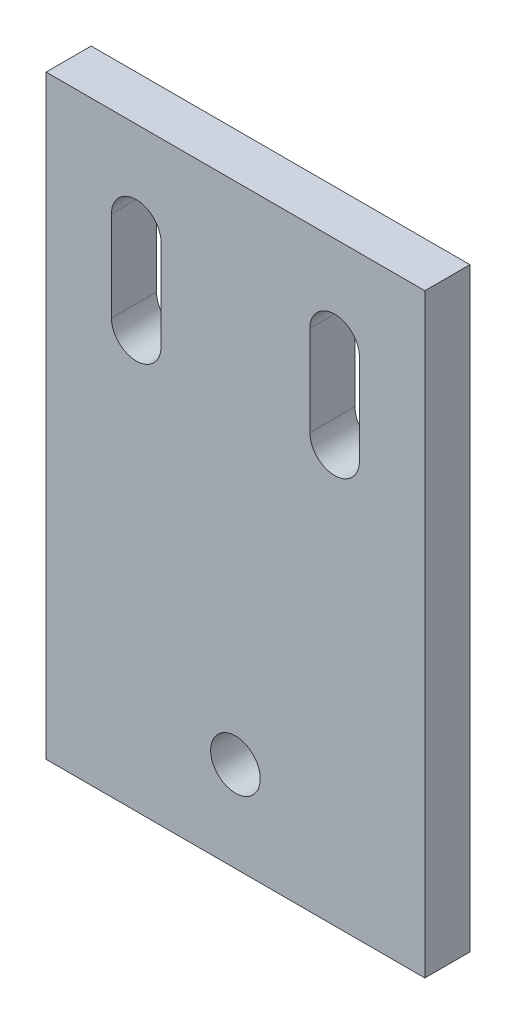
ISO-10303-21;
HEADER;
FILE_DESCRIPTION(('STEP AP214'),'2;1');
FILE_NAME('part.step','',(''),(''),'','','');
FILE_SCHEMA(('AUTOMOTIVE_DESIGN { 1 0 10303 214 1 1 1 1 }'));
ENDSEC;
DATA;
#1=APPLICATION_CONTEXT('core data for automotive mechanical design processes');
#2=APPLICATION_PROTOCOL_DEFINITION('international standard','automotive_design',2000,#1);
#3=PRODUCT_CONTEXT('',#1,'mechanical');
#4=PRODUCT('Part','Part','',(#3));
#5=PRODUCT_RELATED_PRODUCT_CATEGORY('part','',(#4));
#6=PRODUCT_DEFINITION_FORMATION('','',#4);
#7=PRODUCT_DEFINITION_CONTEXT('part definition',#1,'design');
#8=PRODUCT_DEFINITION('design','',#6,#7);
#9=PRODUCT_DEFINITION_SHAPE('','',#8);
#10=(LENGTH_UNIT() NAMED_UNIT(*) SI_UNIT(.MILLI.,.METRE.));
#11=(NAMED_UNIT(*) PLANE_ANGLE_UNIT() SI_UNIT($,.RADIAN.));
#12=(NAMED_UNIT(*) SI_UNIT($,.STERADIAN.) SOLID_ANGLE_UNIT());
#13=UNCERTAINTY_MEASURE_WITH_UNIT(LENGTH_MEASURE(1.E-05),#10,'distance_accuracy_value','');
#14=(GEOMETRIC_REPRESENTATION_CONTEXT(3) GLOBAL_UNCERTAINTY_ASSIGNED_CONTEXT((#13)) GLOBAL_UNIT_ASSIGNED_CONTEXT((#10,
#11,#12)) REPRESENTATION_CONTEXT('',''));
#15=CARTESIAN_POINT('',(0.,0.,0.));
#16=DIRECTION('',(0.,0.,1.));
#17=DIRECTION('',(1.,0.,0.));
#18=AXIS2_PLACEMENT_3D('',#15,#16,#17);
#19=CARTESIAN_POINT('',(-21.,-33.,5.));
#20=DIRECTION('',(1.,0.,0.));
#21=DIRECTION('',(0.,0.,-1.));
#22=AXIS2_PLACEMENT_3D('',#19,#20,#21);
#23=PLANE('',#22);
#24=DIRECTION('',(0.,-1.,0.));
#25=VECTOR('',#24,1.);
#26=CARTESIAN_POINT('',(-21.,-33.,0.));
#27=LINE('',#26,#25);
#28=CARTESIAN_POINT('',(-21.,33.,0.));
#29=VERTEX_POINT('',#28);
#30=CARTESIAN_POINT('',(-21.,-33.,0.));
#31=VERTEX_POINT('',#30);
#32=EDGE_CURVE('E225',#29,#31,#27,.T.);
#33=ORIENTED_EDGE('',*,*,#32,.T.);
#34=DIRECTION('',(0.,0.,-1.));
#35=VECTOR('',#34,1.);
#36=CARTESIAN_POINT('',(-21.,-33.,5.));
#37=LINE('',#36,#35);
#38=CARTESIAN_POINT('',(-21.,-33.,5.));
#39=VERTEX_POINT('',#38);
#40=EDGE_CURVE('E12',#39,#31,#37,.T.);
#41=ORIENTED_EDGE('',*,*,#40,.F.);
#42=DIRECTION('',(0.,-1.,0.));
#43=VECTOR('',#42,1.);
#44=CARTESIAN_POINT('',(-21.,-33.,5.));
#45=LINE('',#44,#43);
#46=CARTESIAN_POINT('',(-21.,33.,5.));
#47=VERTEX_POINT('',#46);
#48=EDGE_CURVE('E226',#47,#39,#45,.T.);
#49=ORIENTED_EDGE('',*,*,#48,.F.);
#50=DIRECTION('',(0.,0.,-1.));
#51=VECTOR('',#50,1.);
#52=CARTESIAN_POINT('',(-21.,33.,5.));
#53=LINE('',#52,#51);
#54=EDGE_CURVE('E243',#47,#29,#53,.T.);
#55=ORIENTED_EDGE('',*,*,#54,.T.);
#56=EDGE_LOOP('',(#33,#41,#49,#55));
#57=FACE_BOUND('',#56,.T.);
#58=ADVANCED_FACE('F48',(#57),#23,.F.);
#59=CARTESIAN_POINT('',(21.,-33.,5.));
#60=DIRECTION('',(0.,1.,0.));
#61=DIRECTION('',(-1.,0.,0.));
#62=AXIS2_PLACEMENT_3D('',#59,#60,#61);
#63=PLANE('',#62);
#64=DIRECTION('',(1.,0.,0.));
#65=VECTOR('',#64,1.);
#66=CARTESIAN_POINT('',(21.,-33.,0.));
#67=LINE('',#66,#65);
#68=CARTESIAN_POINT('',(21.,-33.,0.));
#69=VERTEX_POINT('',#68);
#70=EDGE_CURVE('E247',#31,#69,#67,.T.);
#71=ORIENTED_EDGE('',*,*,#70,.T.);
#72=DIRECTION('',(0.,0.,-1.));
#73=VECTOR('',#72,1.);
#74=CARTESIAN_POINT('',(21.,-33.,5.));
#75=LINE('',#74,#73);
#76=CARTESIAN_POINT('',(21.,-33.,5.));
#77=VERTEX_POINT('',#76);
#78=EDGE_CURVE('E56',#77,#69,#75,.T.);
#79=ORIENTED_EDGE('',*,*,#78,.F.);
#80=DIRECTION('',(1.,0.,0.));
#81=VECTOR('',#80,1.);
#82=CARTESIAN_POINT('',(21.,-33.,5.));
#83=LINE('',#82,#81);
#84=EDGE_CURVE('E231',#39,#77,#83,.T.);
#85=ORIENTED_EDGE('',*,*,#84,.F.);
#86=ORIENTED_EDGE('',*,*,#40,.T.);
#87=EDGE_LOOP('',(#71,#79,#85,#86));
#88=FACE_BOUND('',#87,.T.);
#89=ADVANCED_FACE('F282',(#88),#63,.F.);
#90=CARTESIAN_POINT('',(21.,-33.,5.));
#91=DIRECTION('',(-1.,0.,0.));
#92=DIRECTION('',(0.,0.,1.));
#93=AXIS2_PLACEMENT_3D('',#90,#91,#92);
#94=PLANE('',#93);
#95=DIRECTION('',(0.,1.,0.));
#96=VECTOR('',#95,1.);
#97=CARTESIAN_POINT('',(21.,-33.,0.));
#98=LINE('',#97,#96);
#99=CARTESIAN_POINT('',(21.,33.,0.));
#100=VERTEX_POINT('',#99);
#101=EDGE_CURVE('E250',#69,#100,#98,.T.);
#102=ORIENTED_EDGE('',*,*,#101,.T.);
#103=DIRECTION('',(0.,0.,-1.));
#104=VECTOR('',#103,1.);
#105=CARTESIAN_POINT('',(21.,33.,5.));
#106=LINE('',#105,#104);
#107=CARTESIAN_POINT('',(21.,33.,5.));
#108=VERTEX_POINT('',#107);
#109=EDGE_CURVE('E258',#108,#100,#106,.T.);
#110=ORIENTED_EDGE('',*,*,#109,.F.);
#111=DIRECTION('',(0.,1.,0.));
#112=VECTOR('',#111,1.);
#113=CARTESIAN_POINT('',(21.,-33.,5.));
#114=LINE('',#113,#112);
#115=EDGE_CURVE('E236',#77,#108,#114,.T.);
#116=ORIENTED_EDGE('',*,*,#115,.F.);
#117=ORIENTED_EDGE('',*,*,#78,.T.);
#118=EDGE_LOOP('',(#102,#110,#116,#117));
#119=FACE_BOUND('',#118,.T.);
#120=ADVANCED_FACE('F267',(#119),#94,.F.);
#121=CARTESIAN_POINT('',(21.,33.,5.));
#122=DIRECTION('',(0.,-1.,0.));
#123=DIRECTION('',(0.,0.,-1.));
#124=AXIS2_PLACEMENT_3D('',#121,#122,#123);
#125=PLANE('',#124);
#126=DIRECTION('',(-1.,0.,0.));
#127=VECTOR('',#126,1.);
#128=CARTESIAN_POINT('',(21.,33.,0.));
#129=LINE('',#128,#127);
#130=EDGE_CURVE('E232',#100,#29,#129,.T.);
#131=ORIENTED_EDGE('',*,*,#130,.T.);
#132=ORIENTED_EDGE('',*,*,#54,.F.);
#133=DIRECTION('',(-1.,0.,0.));
#134=VECTOR('',#133,1.);
#135=CARTESIAN_POINT('',(21.,33.,5.));
#136=LINE('',#135,#134);
#137=EDGE_CURVE('E239',#108,#47,#136,.T.);
#138=ORIENTED_EDGE('',*,*,#137,.F.);
#139=ORIENTED_EDGE('',*,*,#109,.T.);
#140=EDGE_LOOP('',(#131,#132,#138,#139));
#141=FACE_BOUND('',#140,.T.);
#142=ADVANCED_FACE('F275',(#141),#125,.F.);
#143=CARTESIAN_POINT('',(0.,0.,5.));
#144=DIRECTION('',(0.,0.,1.));
#145=DIRECTION('',(1.,0.,0.));
#146=AXIS2_PLACEMENT_3D('',#143,#144,#145);
#147=PLANE('',#146);
#148=DIRECTION('',(0.,-1.,0.));
#149=VECTOR('',#148,1.);
#150=CARTESIAN_POINT('',(-13.75,13.,5.));
#151=LINE('',#150,#149);
#152=CARTESIAN_POINT('',(-13.75,23.,5.));
#153=VERTEX_POINT('',#152);
#154=CARTESIAN_POINT('',(-13.75,13.,5.));
#155=VERTEX_POINT('',#154);
#156=EDGE_CURVE('E165',#153,#155,#151,.T.);
#157=ORIENTED_EDGE('',*,*,#156,.F.);
#158=CARTESIAN_POINT('',(-11.,23.,5.));
#159=DIRECTION('',(0.,0.,1.));
#160=DIRECTION('',(1.,0.,0.));
#161=AXIS2_PLACEMENT_3D('',#158,#159,#160);
#162=CIRCLE('',#161,2.74999999999999);
#163=CARTESIAN_POINT('',(-8.25,23.,5.));
#164=VERTEX_POINT('',#163);
#165=EDGE_CURVE('E168',#164,#153,#162,.T.);
#166=ORIENTED_EDGE('',*,*,#165,.F.);
#167=DIRECTION('',(0.,1.,0.));
#168=VECTOR('',#167,1.);
#169=CARTESIAN_POINT('',(-8.25,13.,5.));
#170=LINE('',#169,#168);
#171=CARTESIAN_POINT('',(-8.25,13.,5.));
#172=VERTEX_POINT('',#171);
#173=EDGE_CURVE('E178',#172,#164,#170,.T.);
#174=ORIENTED_EDGE('',*,*,#173,.F.);
#175=CARTESIAN_POINT('',(-11.,13.,5.));
#176=DIRECTION('',(0.,0.,1.));
#177=DIRECTION('',(1.,0.,0.));
#178=AXIS2_PLACEMENT_3D('',#175,#176,#177);
#179=CIRCLE('',#178,2.74999999999999);
#180=EDGE_CURVE('E157',#155,#172,#179,.T.);
#181=ORIENTED_EDGE('',*,*,#180,.F.);
#182=EDGE_LOOP('',(#157,#166,#174,#181));
#183=FACE_BOUND('',#182,.T.);
#184=DIRECTION('',(0.,-1.,0.));
#185=VECTOR('',#184,1.);
#186=CARTESIAN_POINT('',(8.25000000000002,13.,5.));
#187=LINE('',#186,#185);
#188=CARTESIAN_POINT('',(8.25000000000002,23.,5.));
#189=VERTEX_POINT('',#188);
#190=CARTESIAN_POINT('',(8.25000000000002,13.,5.));
#191=VERTEX_POINT('',#190);
#192=EDGE_CURVE('E190',#189,#191,#187,.T.);
#193=ORIENTED_EDGE('',*,*,#192,.F.);
#194=CARTESIAN_POINT('',(11.,23.,5.));
#195=DIRECTION('',(0.,0.,1.));
#196=DIRECTION('',(1.,0.,0.));
#197=AXIS2_PLACEMENT_3D('',#194,#195,#196);
#198=CIRCLE('',#197,2.74999999999999);
#199=CARTESIAN_POINT('',(13.75,23.,5.));
#200=VERTEX_POINT('',#199);
#201=EDGE_CURVE('E194',#200,#189,#198,.T.);
#202=ORIENTED_EDGE('',*,*,#201,.F.);
#203=DIRECTION('',(0.,1.,0.));
#204=VECTOR('',#203,1.);
#205=CARTESIAN_POINT('',(13.75,13.,5.));
#206=LINE('',#205,#204);
#207=CARTESIAN_POINT('',(13.75,13.,5.));
#208=VERTEX_POINT('',#207);
#209=EDGE_CURVE('E202',#208,#200,#206,.T.);
#210=ORIENTED_EDGE('',*,*,#209,.F.);
#211=CARTESIAN_POINT('',(11.,13.,5.));
#212=DIRECTION('',(0.,0.,1.));
#213=DIRECTION('',(1.,0.,0.));
#214=AXIS2_PLACEMENT_3D('',#211,#212,#213);
#215=CIRCLE('',#214,2.74999999999999);
#216=EDGE_CURVE('E179',#191,#208,#215,.T.);
#217=ORIENTED_EDGE('',*,*,#216,.F.);
#218=EDGE_LOOP('',(#193,#202,#210,#217));
#219=FACE_BOUND('',#218,.T.);
#220=CARTESIAN_POINT('',(0.,-23.,5.));
#221=DIRECTION('',(0.,0.,1.));
#222=DIRECTION('',(1.,0.,0.));
#223=AXIS2_PLACEMENT_3D('',#220,#221,#222);
#224=CIRCLE('',#223,2.74999999999999);
#225=CARTESIAN_POINT('',(2.74999999999999,-23.,5.));
#226=VERTEX_POINT('',#225);
#227=EDGE_CURVE('E214',#226,#226,#224,.T.);
#228=ORIENTED_EDGE('',*,*,#227,.F.);
#229=EDGE_LOOP('',(#228));
#230=FACE_BOUND('',#229,.T.);
#231=ORIENTED_EDGE('',*,*,#48,.T.);
#232=ORIENTED_EDGE('',*,*,#84,.T.);
#233=ORIENTED_EDGE('',*,*,#115,.T.);
#234=ORIENTED_EDGE('',*,*,#137,.T.);
#235=EDGE_LOOP('',(#231,#232,#233,#234));
#236=FACE_BOUND('',#235,.T.);
#237=ADVANCED_FACE('F281',(#183,#219,#230,#236),#147,.T.);
#238=CARTESIAN_POINT('',(0.,0.,0.));
#239=DIRECTION('',(0.,0.,1.));
#240=DIRECTION('',(1.,0.,0.));
#241=AXIS2_PLACEMENT_3D('',#238,#239,#240);
#242=PLANE('',#241);
#243=CARTESIAN_POINT('',(11.,23.,0.));
#244=DIRECTION('',(0.,0.,1.));
#245=DIRECTION('',(1.,0.,0.));
#246=AXIS2_PLACEMENT_3D('',#243,#244,#245);
#247=CIRCLE('',#246,2.74999999999999);
#248=CARTESIAN_POINT('',(13.75,23.,0.));
#249=VERTEX_POINT('',#248);
#250=CARTESIAN_POINT('',(8.25000000000002,23.,0.));
#251=VERTEX_POINT('',#250);
#252=EDGE_CURVE('E71',#249,#251,#247,.T.);
#253=ORIENTED_EDGE('',*,*,#252,.T.);
#254=DIRECTION('',(0.,-1.,0.));
#255=VECTOR('',#254,1.);
#256=CARTESIAN_POINT('',(8.25000000000002,13.,0.));
#257=LINE('',#256,#255);
#258=CARTESIAN_POINT('',(8.25000000000002,13.,0.));
#259=VERTEX_POINT('',#258);
#260=EDGE_CURVE('E349',#251,#259,#257,.T.);
#261=ORIENTED_EDGE('',*,*,#260,.T.);
#262=CARTESIAN_POINT('',(11.,13.,0.));
#263=DIRECTION('',(0.,0.,1.));
#264=DIRECTION('',(1.,0.,0.));
#265=AXIS2_PLACEMENT_3D('',#262,#263,#264);
#266=CIRCLE('',#265,2.74999999999999);
#267=CARTESIAN_POINT('',(13.75,13.,0.));
#268=VERTEX_POINT('',#267);
#269=EDGE_CURVE('E195',#259,#268,#266,.T.);
#270=ORIENTED_EDGE('',*,*,#269,.T.);
#271=DIRECTION('',(0.,1.,0.));
#272=VECTOR('',#271,1.);
#273=CARTESIAN_POINT('',(13.75,13.,0.));
#274=LINE('',#273,#272);
#275=EDGE_CURVE('E369',#268,#249,#274,.T.);
#276=ORIENTED_EDGE('',*,*,#275,.T.);
#277=EDGE_LOOP('',(#253,#261,#270,#276));
#278=FACE_BOUND('',#277,.T.);
#279=CARTESIAN_POINT('',(-11.,23.,0.));
#280=DIRECTION('',(0.,0.,1.));
#281=DIRECTION('',(1.,0.,0.));
#282=AXIS2_PLACEMENT_3D('',#279,#280,#281);
#283=CIRCLE('',#282,2.74999999999999);
#284=CARTESIAN_POINT('',(-8.25,23.,0.));
#285=VERTEX_POINT('',#284);
#286=CARTESIAN_POINT('',(-13.75,23.,0.));
#287=VERTEX_POINT('',#286);
#288=EDGE_CURVE('E63',#285,#287,#283,.T.);
#289=ORIENTED_EDGE('',*,*,#288,.T.);
#290=DIRECTION('',(0.,-1.,0.));
#291=VECTOR('',#290,1.);
#292=CARTESIAN_POINT('',(-13.75,13.,0.));
#293=LINE('',#292,#291);
#294=CARTESIAN_POINT('',(-13.75,13.,0.));
#295=VERTEX_POINT('',#294);
#296=EDGE_CURVE('E160',#287,#295,#293,.T.);
#297=ORIENTED_EDGE('',*,*,#296,.T.);
#298=CARTESIAN_POINT('',(-11.,13.,0.));
#299=DIRECTION('',(0.,0.,1.));
#300=DIRECTION('',(1.,0.,0.));
#301=AXIS2_PLACEMENT_3D('',#298,#299,#300);
#302=CIRCLE('',#301,2.74999999999999);
#303=CARTESIAN_POINT('',(-8.25,13.,0.));
#304=VERTEX_POINT('',#303);
#305=EDGE_CURVE('E149',#295,#304,#302,.T.);
#306=ORIENTED_EDGE('',*,*,#305,.T.);
#307=DIRECTION('',(0.,1.,0.));
#308=VECTOR('',#307,1.);
#309=CARTESIAN_POINT('',(-8.25,13.,0.));
#310=LINE('',#309,#308);
#311=EDGE_CURVE('E140',#304,#285,#310,.T.);
#312=ORIENTED_EDGE('',*,*,#311,.T.);
#313=EDGE_LOOP('',(#289,#297,#306,#312));
#314=FACE_BOUND('',#313,.T.);
#315=CARTESIAN_POINT('',(0.,-23.,0.));
#316=DIRECTION('',(0.,0.,1.));
#317=DIRECTION('',(1.,0.,0.));
#318=AXIS2_PLACEMENT_3D('',#315,#316,#317);
#319=CIRCLE('',#318,2.74999999999999);
#320=CARTESIAN_POINT('',(2.74999999999999,-23.,0.));
#321=VERTEX_POINT('',#320);
#322=EDGE_CURVE('E220',#321,#321,#319,.T.);
#323=ORIENTED_EDGE('',*,*,#322,.T.);
#324=EDGE_LOOP('',(#323));
#325=FACE_BOUND('',#324,.T.);
#326=ORIENTED_EDGE('',*,*,#32,.F.);
#327=ORIENTED_EDGE('',*,*,#130,.F.);
#328=ORIENTED_EDGE('',*,*,#101,.F.);
#329=ORIENTED_EDGE('',*,*,#70,.F.);
#330=EDGE_LOOP('',(#326,#327,#328,#329));
#331=FACE_BOUND('',#330,.T.);
#332=ADVANCED_FACE('F162',(#278,#314,#325,#331),#242,.F.);
#333=CARTESIAN_POINT('',(0.,-23.,5.));
#334=DIRECTION('',(0.,0.,1.));
#335=DIRECTION('',(1.,0.,0.));
#336=AXIS2_PLACEMENT_3D('',#333,#334,#335);
#337=CYLINDRICAL_SURFACE('',#336,2.74999999999999);
#338=ORIENTED_EDGE('',*,*,#322,.F.);
#339=EDGE_LOOP('',(#338));
#340=FACE_BOUND('',#339,.T.);
#341=ORIENTED_EDGE('',*,*,#227,.T.);
#342=EDGE_LOOP('',(#341));
#343=FACE_BOUND('',#342,.T.);
#344=ADVANCED_FACE('F294',(#340,#343),#337,.F.);
#345=CARTESIAN_POINT('',(8.25000000000002,13.,0.));
#346=DIRECTION('',(-1.,0.,0.));
#347=DIRECTION('',(0.,-1.,0.));
#348=AXIS2_PLACEMENT_3D('',#345,#346,#347);
#349=PLANE('',#348);
#350=ORIENTED_EDGE('',*,*,#192,.T.);
#351=DIRECTION('',(0.,0.,1.));
#352=VECTOR('',#351,1.);
#353=CARTESIAN_POINT('',(8.25000000000002,13.,0.));
#354=LINE('',#353,#352);
#355=EDGE_CURVE('E196',#259,#191,#354,.T.);
#356=ORIENTED_EDGE('',*,*,#355,.F.);
#357=ORIENTED_EDGE('',*,*,#260,.F.);
#358=DIRECTION('',(0.,0.,1.));
#359=VECTOR('',#358,1.);
#360=CARTESIAN_POINT('',(8.25000000000002,23.,0.));
#361=LINE('',#360,#359);
#362=EDGE_CURVE('E352',#251,#189,#361,.T.);
#363=ORIENTED_EDGE('',*,*,#362,.T.);
#364=EDGE_LOOP('',(#350,#356,#357,#363));
#365=FACE_BOUND('',#364,.T.);
#366=ADVANCED_FACE('F301',(#365),#349,.F.);
#367=CARTESIAN_POINT('',(13.75,13.,0.));
#368=DIRECTION('',(1.,0.,0.));
#369=DIRECTION('',(0.,1.,0.));
#370=AXIS2_PLACEMENT_3D('',#367,#368,#369);
#371=PLANE('',#370);
#372=ORIENTED_EDGE('',*,*,#209,.T.);
#373=DIRECTION('',(0.,0.,1.));
#374=VECTOR('',#373,1.);
#375=CARTESIAN_POINT('',(13.75,23.,0.));
#376=LINE('',#375,#374);
#377=EDGE_CURVE('E350',#249,#200,#376,.T.);
#378=ORIENTED_EDGE('',*,*,#377,.F.);
#379=ORIENTED_EDGE('',*,*,#275,.F.);
#380=DIRECTION('',(0.,0.,1.));
#381=VECTOR('',#380,1.);
#382=CARTESIAN_POINT('',(13.75,13.,0.));
#383=LINE('',#382,#381);
#384=EDGE_CURVE('E346',#268,#208,#383,.T.);
#385=ORIENTED_EDGE('',*,*,#384,.T.);
#386=EDGE_LOOP('',(#372,#378,#379,#385));
#387=FACE_BOUND('',#386,.T.);
#388=ADVANCED_FACE('F305',(#387),#371,.F.);
#389=CARTESIAN_POINT('',(11.,13.,0.));
#390=DIRECTION('',(0.,0.,1.));
#391=DIRECTION('',(1.,0.,0.));
#392=AXIS2_PLACEMENT_3D('',#389,#390,#391);
#393=CYLINDRICAL_SURFACE('',#392,2.74999999999999);
#394=ORIENTED_EDGE('',*,*,#216,.T.);
#395=ORIENTED_EDGE('',*,*,#384,.F.);
#396=ORIENTED_EDGE('',*,*,#269,.F.);
#397=ORIENTED_EDGE('',*,*,#355,.T.);
#398=EDGE_LOOP('',(#394,#395,#396,#397));
#399=FACE_BOUND('',#398,.T.);
#400=ADVANCED_FACE('F311',(#399),#393,.F.);
#401=CARTESIAN_POINT('',(11.,23.,0.));
#402=DIRECTION('',(0.,0.,1.));
#403=DIRECTION('',(1.,0.,0.));
#404=AXIS2_PLACEMENT_3D('',#401,#402,#403);
#405=CYLINDRICAL_SURFACE('',#404,2.74999999999999);
#406=ORIENTED_EDGE('',*,*,#201,.T.);
#407=ORIENTED_EDGE('',*,*,#362,.F.);
#408=ORIENTED_EDGE('',*,*,#252,.F.);
#409=ORIENTED_EDGE('',*,*,#377,.T.);
#410=EDGE_LOOP('',(#406,#407,#408,#409));
#411=FACE_BOUND('',#410,.T.);
#412=ADVANCED_FACE('F307',(#411),#405,.F.);
#413=CARTESIAN_POINT('',(-13.75,13.,0.));
#414=DIRECTION('',(-1.,0.,0.));
#415=DIRECTION('',(0.,0.,1.));
#416=AXIS2_PLACEMENT_3D('',#413,#414,#415);
#417=PLANE('',#416);
#418=ORIENTED_EDGE('',*,*,#156,.T.);
#419=DIRECTION('',(0.,0.,1.));
#420=VECTOR('',#419,1.);
#421=CARTESIAN_POINT('',(-13.75,13.,0.));
#422=LINE('',#421,#420);
#423=EDGE_CURVE('E221',#295,#155,#422,.T.);
#424=ORIENTED_EDGE('',*,*,#423,.F.);
#425=ORIENTED_EDGE('',*,*,#296,.F.);
#426=DIRECTION('',(0.,0.,1.));
#427=VECTOR('',#426,1.);
#428=CARTESIAN_POINT('',(-13.75,23.,0.));
#429=LINE('',#428,#427);
#430=EDGE_CURVE('E330',#287,#153,#429,.T.);
#431=ORIENTED_EDGE('',*,*,#430,.T.);
#432=EDGE_LOOP('',(#418,#424,#425,#431));
#433=FACE_BOUND('',#432,.T.);
#434=ADVANCED_FACE('F310',(#433),#417,.F.);
#435=CARTESIAN_POINT('',(-8.25,13.,0.));
#436=DIRECTION('',(1.,0.,0.));
#437=DIRECTION('',(0.,1.,0.));
#438=AXIS2_PLACEMENT_3D('',#435,#436,#437);
#439=PLANE('',#438);
#440=ORIENTED_EDGE('',*,*,#173,.T.);
#441=DIRECTION('',(0.,0.,1.));
#442=VECTOR('',#441,1.);
#443=CARTESIAN_POINT('',(-8.25,23.,0.));
#444=LINE('',#443,#442);
#445=EDGE_CURVE('E145',#285,#164,#444,.T.);
#446=ORIENTED_EDGE('',*,*,#445,.F.);
#447=ORIENTED_EDGE('',*,*,#311,.F.);
#448=DIRECTION('',(0.,0.,1.));
#449=VECTOR('',#448,1.);
#450=CARTESIAN_POINT('',(-8.25,13.,0.));
#451=LINE('',#450,#449);
#452=EDGE_CURVE('E143',#304,#172,#451,.T.);
#453=ORIENTED_EDGE('',*,*,#452,.T.);
#454=EDGE_LOOP('',(#440,#446,#447,#453));
#455=FACE_BOUND('',#454,.T.);
#456=ADVANCED_FACE('F142',(#455),#439,.F.);
#457=CARTESIAN_POINT('',(-11.,13.,0.));
#458=DIRECTION('',(0.,0.,1.));
#459=DIRECTION('',(1.,0.,0.));
#460=AXIS2_PLACEMENT_3D('',#457,#458,#459);
#461=CYLINDRICAL_SURFACE('',#460,2.74999999999999);
#462=ORIENTED_EDGE('',*,*,#180,.T.);
#463=ORIENTED_EDGE('',*,*,#452,.F.);
#464=ORIENTED_EDGE('',*,*,#305,.F.);
#465=ORIENTED_EDGE('',*,*,#423,.T.);
#466=EDGE_LOOP('',(#462,#463,#464,#465));
#467=FACE_BOUND('',#466,.T.);
#468=ADVANCED_FACE('F153',(#467),#461,.F.);
#469=CARTESIAN_POINT('',(-11.,23.,0.));
#470=DIRECTION('',(0.,0.,1.));
#471=DIRECTION('',(1.,0.,0.));
#472=AXIS2_PLACEMENT_3D('',#469,#470,#471);
#473=CYLINDRICAL_SURFACE('',#472,2.74999999999999);
#474=ORIENTED_EDGE('',*,*,#165,.T.);
#475=ORIENTED_EDGE('',*,*,#430,.F.);
#476=ORIENTED_EDGE('',*,*,#288,.F.);
#477=ORIENTED_EDGE('',*,*,#445,.T.);
#478=EDGE_LOOP('',(#474,#475,#476,#477));
#479=FACE_BOUND('',#478,.T.);
#480=ADVANCED_FACE('F320',(#479),#473,.F.);
#481=CLOSED_SHELL('',(#58,#89,#120,#142,#237,#332,#344,#366,#388,#400,#412,#434,#456,#468,#480));
#482=MANIFOLD_SOLID_BREP('B2',#481);
#483=ADVANCED_BREP_SHAPE_REPRESENTATION('',(#18,#482),#14);
#484=SHAPE_DEFINITION_REPRESENTATION(#9,#483);
ENDSEC;
END-ISO-10303-21;
